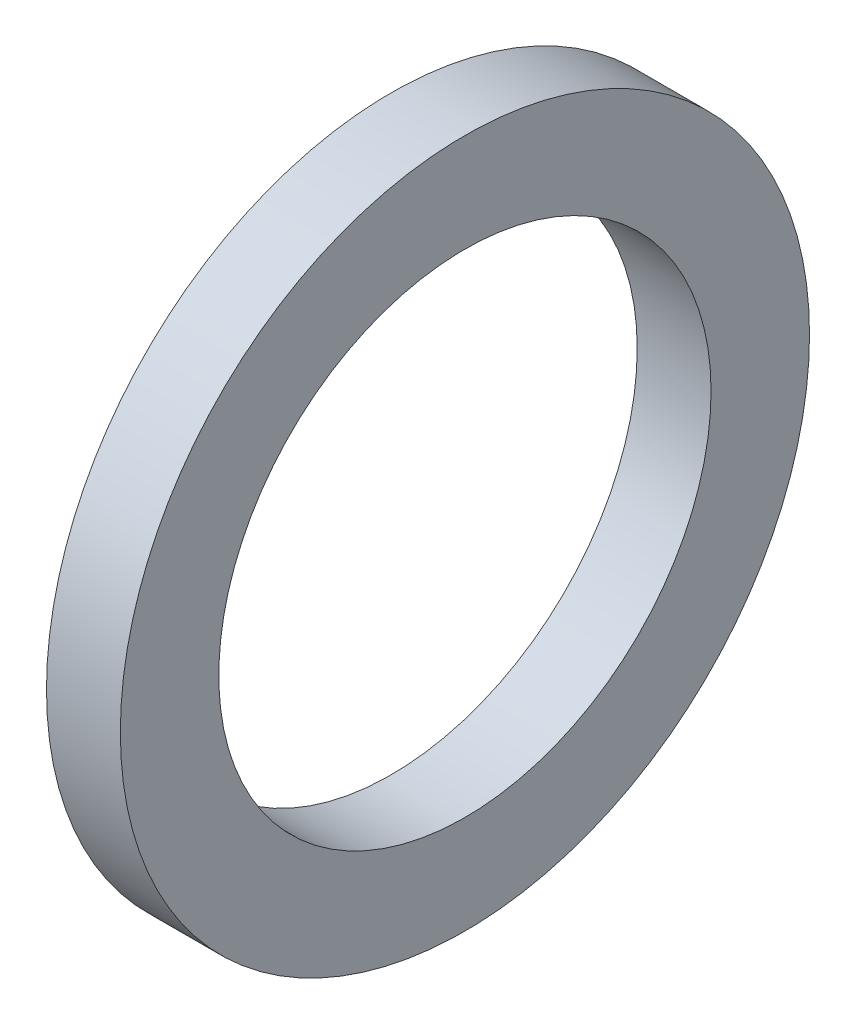
ISO-10303-21;
HEADER;
FILE_DESCRIPTION(('STEP AP214'),'2;1');
FILE_NAME('part.step','',(''),(''),'','','');
FILE_SCHEMA(('AUTOMOTIVE_DESIGN { 1 0 10303 214 1 1 1 1 }'));
ENDSEC;
DATA;
#1=APPLICATION_CONTEXT('core data for automotive mechanical design processes');
#2=APPLICATION_PROTOCOL_DEFINITION('international standard','automotive_design',2000,#1);
#3=PRODUCT_CONTEXT('',#1,'mechanical');
#4=PRODUCT('Part','Part','',(#3));
#5=PRODUCT_RELATED_PRODUCT_CATEGORY('part','',(#4));
#6=PRODUCT_DEFINITION_FORMATION('','',#4);
#7=PRODUCT_DEFINITION_CONTEXT('part definition',#1,'design');
#8=PRODUCT_DEFINITION('design','',#6,#7);
#9=PRODUCT_DEFINITION_SHAPE('','',#8);
#10=(LENGTH_UNIT() NAMED_UNIT(*) SI_UNIT(.MILLI.,.METRE.));
#11=(NAMED_UNIT(*) PLANE_ANGLE_UNIT() SI_UNIT($,.RADIAN.));
#12=(NAMED_UNIT(*) SI_UNIT($,.STERADIAN.) SOLID_ANGLE_UNIT());
#13=UNCERTAINTY_MEASURE_WITH_UNIT(LENGTH_MEASURE(1.E-05),#10,'distance_accuracy_value','');
#14=(GEOMETRIC_REPRESENTATION_CONTEXT(3) GLOBAL_UNCERTAINTY_ASSIGNED_CONTEXT((#13)) GLOBAL_UNIT_ASSIGNED_CONTEXT((#10,
#11,#12)) REPRESENTATION_CONTEXT('',''));
#15=CARTESIAN_POINT('',(0.,0.,0.));
#16=DIRECTION('',(0.,0.,1.));
#17=DIRECTION('',(1.,0.,0.));
#18=AXIS2_PLACEMENT_3D('',#15,#16,#17);
#19=CARTESIAN_POINT('',(3.,0.,0.));
#20=DIRECTION('',(1.,0.,0.));
#21=DIRECTION('',(0.,0.,-1.));
#22=AXIS2_PLACEMENT_3D('',#19,#20,#21);
#23=PLANE('',#22);
#24=CARTESIAN_POINT('',(3.,0.,0.));
#25=DIRECTION('',(1.,0.,0.));
#26=DIRECTION('',(0.,0.,-1.));
#27=AXIS2_PLACEMENT_3D('',#24,#25,#26);
#28=CIRCLE('',#27,14.);
#29=CARTESIAN_POINT('',(3.,0.,-14.));
#30=VERTEX_POINT('',#29);
#31=EDGE_CURVE('E10',#30,#30,#28,.T.);
#32=ORIENTED_EDGE('',*,*,#31,.T.);
#33=EDGE_LOOP('',(#32));
#34=FACE_BOUND('',#33,.T.);
#35=CARTESIAN_POINT('',(3.,0.,0.));
#36=DIRECTION('',(1.,0.,0.));
#37=DIRECTION('',(0.,0.,-1.));
#38=AXIS2_PLACEMENT_3D('',#35,#36,#37);
#39=CIRCLE('',#38,10.);
#40=CARTESIAN_POINT('',(3.,0.,-10.));
#41=VERTEX_POINT('',#40);
#42=EDGE_CURVE('E44',#41,#41,#39,.T.);
#43=ORIENTED_EDGE('',*,*,#42,.F.);
#44=EDGE_LOOP('',(#43));
#45=FACE_BOUND('',#44,.T.);
#46=ADVANCED_FACE('F33',(#34,#45),#23,.T.);
#47=CARTESIAN_POINT('',(0.,0.,0.));
#48=DIRECTION('',(1.,0.,0.));
#49=DIRECTION('',(0.,0.,-1.));
#50=AXIS2_PLACEMENT_3D('',#47,#48,#49);
#51=PLANE('',#50);
#52=CARTESIAN_POINT('',(0.,0.,0.));
#53=DIRECTION('',(1.,0.,0.));
#54=DIRECTION('',(0.,0.,-1.));
#55=AXIS2_PLACEMENT_3D('',#52,#53,#54);
#56=CIRCLE('',#55,14.);
#57=CARTESIAN_POINT('',(0.,0.,-14.));
#58=VERTEX_POINT('',#57);
#59=EDGE_CURVE('E37',#58,#58,#56,.T.);
#60=ORIENTED_EDGE('',*,*,#59,.F.);
#61=EDGE_LOOP('',(#60));
#62=FACE_BOUND('',#61,.T.);
#63=CARTESIAN_POINT('',(0.,0.,0.));
#64=DIRECTION('',(1.,0.,0.));
#65=DIRECTION('',(0.,0.,-1.));
#66=AXIS2_PLACEMENT_3D('',#63,#64,#65);
#67=CIRCLE('',#66,10.);
#68=CARTESIAN_POINT('',(0.,0.,-10.));
#69=VERTEX_POINT('',#68);
#70=EDGE_CURVE('E46',#69,#69,#67,.T.);
#71=ORIENTED_EDGE('',*,*,#70,.T.);
#72=EDGE_LOOP('',(#71));
#73=FACE_BOUND('',#72,.T.);
#74=ADVANCED_FACE('F56',(#62,#73),#51,.F.);
#75=CARTESIAN_POINT('',(3.,0.,0.));
#76=DIRECTION('',(-1.,0.,0.));
#77=DIRECTION('',(0.,0.,1.));
#78=AXIS2_PLACEMENT_3D('',#75,#76,#77);
#79=CYLINDRICAL_SURFACE('',#78,14.);
#80=ORIENTED_EDGE('',*,*,#31,.F.);
#81=EDGE_LOOP('',(#80));
#82=FACE_BOUND('',#81,.T.);
#83=ORIENTED_EDGE('',*,*,#59,.T.);
#84=EDGE_LOOP('',(#83));
#85=FACE_BOUND('',#84,.T.);
#86=ADVANCED_FACE('F35',(#82,#85),#79,.T.);
#87=CARTESIAN_POINT('',(3.,0.,0.));
#88=DIRECTION('',(-1.,0.,0.));
#89=DIRECTION('',(0.,0.,1.));
#90=AXIS2_PLACEMENT_3D('',#87,#88,#89);
#91=CYLINDRICAL_SURFACE('',#90,10.);
#92=ORIENTED_EDGE('',*,*,#42,.T.);
#93=EDGE_LOOP('',(#92));
#94=FACE_BOUND('',#93,.T.);
#95=ORIENTED_EDGE('',*,*,#70,.F.);
#96=EDGE_LOOP('',(#95));
#97=FACE_BOUND('',#96,.T.);
#98=ADVANCED_FACE('F52',(#94,#97),#91,.F.);
#99=CLOSED_SHELL('',(#46,#74,#86,#98));
#100=MANIFOLD_SOLID_BREP('B2',#99);
#101=ADVANCED_BREP_SHAPE_REPRESENTATION('',(#18,#100),#14);
#102=SHAPE_DEFINITION_REPRESENTATION(#9,#101);
ENDSEC;
END-ISO-10303-21;
